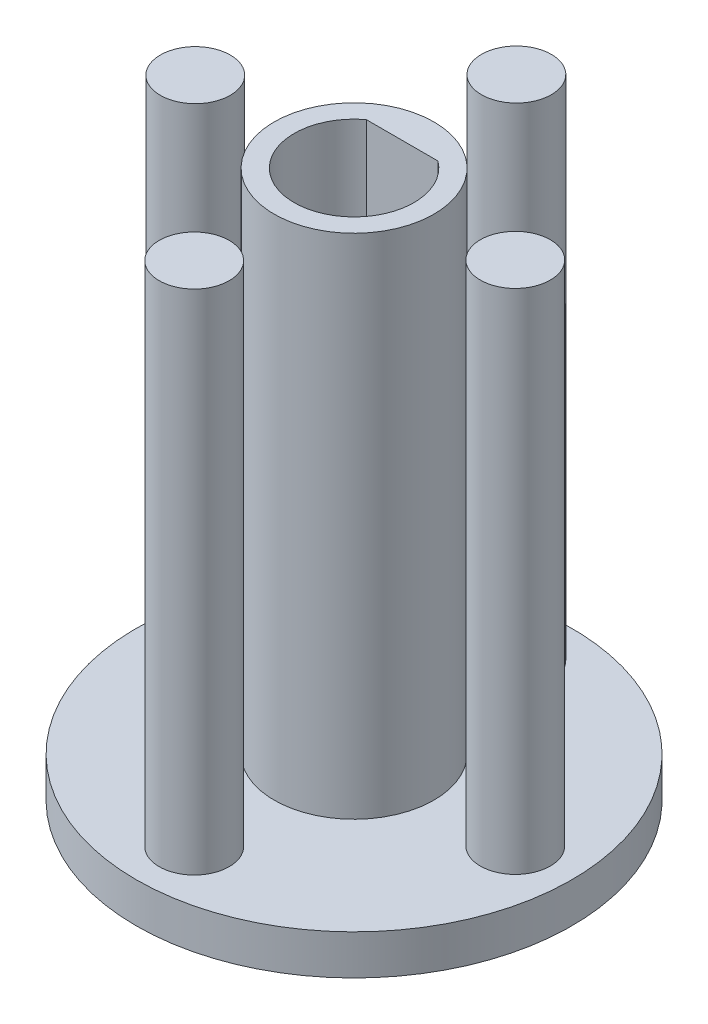
ISO-10303-21;
HEADER;
FILE_DESCRIPTION(('STEP AP214'),'2;1');
FILE_NAME('part.step','',(''),(''),'','','');
FILE_SCHEMA(('AUTOMOTIVE_DESIGN { 1 0 10303 214 1 1 1 1 }'));
ENDSEC;
DATA;
#1=APPLICATION_CONTEXT('core data for automotive mechanical design processes');
#2=APPLICATION_PROTOCOL_DEFINITION('international standard','automotive_design',2000,#1);
#3=PRODUCT_CONTEXT('',#1,'mechanical');
#4=PRODUCT('Part','Part','',(#3));
#5=PRODUCT_RELATED_PRODUCT_CATEGORY('part','',(#4));
#6=PRODUCT_DEFINITION_FORMATION('','',#4);
#7=PRODUCT_DEFINITION_CONTEXT('part definition',#1,'design');
#8=PRODUCT_DEFINITION('design','',#6,#7);
#9=PRODUCT_DEFINITION_SHAPE('','',#8);
#10=(LENGTH_UNIT() NAMED_UNIT(*) SI_UNIT(.MILLI.,.METRE.));
#11=(NAMED_UNIT(*) PLANE_ANGLE_UNIT() SI_UNIT($,.RADIAN.));
#12=(NAMED_UNIT(*) SI_UNIT($,.STERADIAN.) SOLID_ANGLE_UNIT());
#13=UNCERTAINTY_MEASURE_WITH_UNIT(LENGTH_MEASURE(1.E-05),#10,'distance_accuracy_value','');
#14=(GEOMETRIC_REPRESENTATION_CONTEXT(3) GLOBAL_UNCERTAINTY_ASSIGNED_CONTEXT((#13)) GLOBAL_UNIT_ASSIGNED_CONTEXT((#10,
#11,#12)) REPRESENTATION_CONTEXT('',''));
#15=CARTESIAN_POINT('',(0.,0.,0.));
#16=DIRECTION('',(0.,0.,1.));
#17=DIRECTION('',(1.,0.,0.));
#18=AXIS2_PLACEMENT_3D('',#15,#16,#17);
#19=CARTESIAN_POINT('',(0.,2.,0.));
#20=DIRECTION('',(0.,1.,0.));
#21=DIRECTION('',(0.,0.,1.));
#22=AXIS2_PLACEMENT_3D('',#19,#20,#21);
#23=PLANE('',#22);
#24=CARTESIAN_POINT('',(0.,2.,0.));
#25=DIRECTION('',(0.,1.,0.));
#26=DIRECTION('',(0.,0.,1.));
#27=AXIS2_PLACEMENT_3D('',#24,#25,#26);
#28=CIRCLE('',#27,10.9);
#29=CARTESIAN_POINT('',(0.,2.,10.9));
#30=VERTEX_POINT('',#29);
#31=EDGE_CURVE('E110',#30,#30,#28,.T.);
#32=ORIENTED_EDGE('',*,*,#31,.T.);
#33=EDGE_LOOP('',(#32));
#34=FACE_BOUND('',#33,.T.);
#35=CARTESIAN_POINT('',(-7.99946540436632,2.,-0.0531912101153402));
#36=DIRECTION('',(0.,1.,0.));
#37=DIRECTION('',(0.,0.,1.));
#38=AXIS2_PLACEMENT_3D('',#35,#36,#37);
#39=CIRCLE('',#38,1.75);
#40=CARTESIAN_POINT('',(-7.99946540436632,1.99999999999999,-1.80319121011534));
#41=VERTEX_POINT('',#40);
#42=EDGE_CURVE('E46',#41,#41,#39,.T.);
#43=ORIENTED_EDGE('',*,*,#42,.F.);
#44=EDGE_LOOP('',(#43));
#45=FACE_BOUND('',#44,.T.);
#46=CARTESIAN_POINT('',(0.0091799489627781,2.,8.00905715153994));
#47=DIRECTION('',(0.,1.,0.));
#48=DIRECTION('',(0.,0.,1.));
#49=AXIS2_PLACEMENT_3D('',#46,#47,#48);
#50=CIRCLE('',#49,1.75);
#51=CARTESIAN_POINT('',(0.0091799489627781,1.99999999999999,6.25905715153994));
#52=VERTEX_POINT('',#51);
#53=EDGE_CURVE('E106',#52,#52,#50,.F.);
#54=ORIENTED_EDGE('',*,*,#53,.T.);
#55=EDGE_LOOP('',(#54));
#56=FACE_BOUND('',#55,.T.);
#57=CARTESIAN_POINT('',(8.01767982733765,2.,-0.0533357152510716));
#58=DIRECTION('',(0.,1.,0.));
#59=DIRECTION('',(0.,0.,1.));
#60=AXIS2_PLACEMENT_3D('',#57,#58,#59);
#61=CIRCLE('',#60,1.75);
#62=CARTESIAN_POINT('',(8.01767982733765,1.99999999999999,-1.80333571525107));
#63=VERTEX_POINT('',#62);
#64=EDGE_CURVE('E100',#63,#63,#61,.F.);
#65=ORIENTED_EDGE('',*,*,#64,.T.);
#66=EDGE_LOOP('',(#65));
#67=FACE_BOUND('',#66,.T.);
#68=CARTESIAN_POINT('',(0.00903447400855788,2.,-8.11558407690636));
#69=DIRECTION('',(0.,1.,0.));
#70=DIRECTION('',(0.,0.,1.));
#71=AXIS2_PLACEMENT_3D('',#68,#69,#70);
#72=CIRCLE('',#71,1.75000000000001);
#73=CARTESIAN_POINT('',(0.00903447400855788,1.99999999999999,-9.86558407690636));
#74=VERTEX_POINT('',#73);
#75=EDGE_CURVE('E94',#74,#74,#72,.F.);
#76=ORIENTED_EDGE('',*,*,#75,.T.);
#77=EDGE_LOOP('',(#76));
#78=FACE_BOUND('',#77,.T.);
#79=CARTESIAN_POINT('',(0.,2.,0.));
#80=DIRECTION('',(0.,1.,0.));
#81=DIRECTION('',(0.,0.,1.));
#82=AXIS2_PLACEMENT_3D('',#79,#80,#81);
#83=CIRCLE('',#82,4.);
#84=CARTESIAN_POINT('',(0.,1.99999999999999,-4.));
#85=VERTEX_POINT('',#84);
#86=EDGE_CURVE('E88',#85,#85,#83,.F.);
#87=ORIENTED_EDGE('',*,*,#86,.T.);
#88=EDGE_LOOP('',(#87));
#89=FACE_BOUND('',#88,.T.);
#90=ADVANCED_FACE('F42',(#34,#45,#56,#67,#78,#89),#23,.T.);
#91=CARTESIAN_POINT('',(-7.99946540436632,27.4,-0.0531912101153402));
#92=DIRECTION('',(0.,-1.,0.));
#93=DIRECTION('',(0.,0.,-1.));
#94=AXIS2_PLACEMENT_3D('',#91,#92,#93);
#95=CYLINDRICAL_SURFACE('',#94,1.75);
#96=CARTESIAN_POINT('',(-7.99946540436632,27.4,-0.0531912101153402));
#97=DIRECTION('',(0.,1.,0.));
#98=DIRECTION('',(0.,0.,1.));
#99=AXIS2_PLACEMENT_3D('',#96,#97,#98);
#100=CIRCLE('',#99,1.75);
#101=CARTESIAN_POINT('',(-7.99946540436632,27.4,-1.80319121011534));
#102=VERTEX_POINT('',#101);
#103=EDGE_CURVE('E12',#102,#102,#100,.T.);
#104=CARTESIAN_POINT('',(-7.99946540436632,1.99999999999999,-1.80319121011534));
#105=CARTESIAN_POINT('',(-7.99946540436632,2.26458333333333,-1.80319121011534));
#106=CARTESIAN_POINT('',(-7.99946540436632,2.52916666666666,-1.80319121011534));
#107=CARTESIAN_POINT('',(-7.99946540436632,3.05833333333333,-1.80319121011534));
#108=CARTESIAN_POINT('',(-7.99946540436632,3.32291666666666,-1.80319121011534));
#109=CARTESIAN_POINT('',(-7.99946540436632,3.85208333333333,-1.80319121011534));
#110=CARTESIAN_POINT('',(-7.99946540436632,4.11666666666666,-1.80319121011534));
#111=CARTESIAN_POINT('',(-7.99946540436632,4.64583333333333,-1.80319121011534));
#112=CARTESIAN_POINT('',(-7.99946540436632,4.91041666666666,-1.80319121011534));
#113=CARTESIAN_POINT('',(-7.99946540436632,5.43958333333333,-1.80319121011534));
#114=CARTESIAN_POINT('',(-7.99946540436632,5.70416666666666,-1.80319121011534));
#115=CARTESIAN_POINT('',(-7.99946540436632,6.23333333333333,-1.80319121011534));
#116=CARTESIAN_POINT('',(-7.99946540436632,6.49791666666666,-1.80319121011534));
#117=CARTESIAN_POINT('',(-7.99946540436632,7.02708333333333,-1.80319121011534));
#118=CARTESIAN_POINT('',(-7.99946540436632,7.29166666666666,-1.80319121011534));
#119=CARTESIAN_POINT('',(-7.99946540436632,7.82083333333333,-1.80319121011534));
#120=CARTESIAN_POINT('',(-7.99946540436632,8.08541666666666,-1.80319121011534));
#121=CARTESIAN_POINT('',(-7.99946540436632,8.61458333333333,-1.80319121011534));
#122=CARTESIAN_POINT('',(-7.99946540436632,8.87916666666666,-1.80319121011534));
#123=CARTESIAN_POINT('',(-7.99946540436632,9.40833333333333,-1.80319121011534));
#124=CARTESIAN_POINT('',(-7.99946540436632,9.67291666666666,-1.80319121011534));
#125=CARTESIAN_POINT('',(-7.99946540436632,10.2020833333333,-1.80319121011534));
#126=CARTESIAN_POINT('',(-7.99946540436632,10.4666666666667,-1.80319121011534));
#127=CARTESIAN_POINT('',(-7.99946540436632,10.9958333333333,-1.80319121011534));
#128=CARTESIAN_POINT('',(-7.99946540436632,11.2604166666667,-1.80319121011534));
#129=CARTESIAN_POINT('',(-7.99946540436632,11.7895833333333,-1.80319121011534));
#130=CARTESIAN_POINT('',(-7.99946540436632,12.0541666666667,-1.80319121011534));
#131=CARTESIAN_POINT('',(-7.99946540436632,12.5833333333333,-1.80319121011534));
#132=CARTESIAN_POINT('',(-7.99946540436632,12.8479166666667,-1.80319121011534));
#133=CARTESIAN_POINT('',(-7.99946540436632,13.3770833333333,-1.80319121011534));
#134=CARTESIAN_POINT('',(-7.99946540436632,13.6416666666667,-1.80319121011534));
#135=CARTESIAN_POINT('',(-7.99946540436632,14.1708333333333,-1.80319121011534));
#136=CARTESIAN_POINT('',(-7.99946540436632,14.4354166666667,-1.80319121011534));
#137=CARTESIAN_POINT('',(-7.99946540436632,14.9645833333333,-1.80319121011534));
#138=CARTESIAN_POINT('',(-7.99946540436632,15.2291666666667,-1.80319121011534));
#139=CARTESIAN_POINT('',(-7.99946540436632,15.7583333333333,-1.80319121011534));
#140=CARTESIAN_POINT('',(-7.99946540436632,16.0229166666667,-1.80319121011534));
#141=CARTESIAN_POINT('',(-7.99946540436632,16.5520833333333,-1.80319121011534));
#142=CARTESIAN_POINT('',(-7.99946540436632,16.8166666666667,-1.80319121011534));
#143=CARTESIAN_POINT('',(-7.99946540436632,17.3458333333333,-1.80319121011534));
#144=CARTESIAN_POINT('',(-7.99946540436632,17.6104166666667,-1.80319121011534));
#145=CARTESIAN_POINT('',(-7.99946540436632,18.1395833333333,-1.80319121011534));
#146=CARTESIAN_POINT('',(-7.99946540436632,18.4041666666667,-1.80319121011534));
#147=CARTESIAN_POINT('',(-7.99946540436632,18.9333333333333,-1.80319121011534));
#148=CARTESIAN_POINT('',(-7.99946540436632,19.1979166666667,-1.80319121011534));
#149=CARTESIAN_POINT('',(-7.99946540436632,19.7270833333333,-1.80319121011534));
#150=CARTESIAN_POINT('',(-7.99946540436632,19.9916666666667,-1.80319121011534));
#151=CARTESIAN_POINT('',(-7.99946540436632,20.5208333333333,-1.80319121011534));
#152=CARTESIAN_POINT('',(-7.99946540436632,20.7854166666667,-1.80319121011534));
#153=CARTESIAN_POINT('',(-7.99946540436632,21.3145833333333,-1.80319121011534));
#154=CARTESIAN_POINT('',(-7.99946540436632,21.5791666666667,-1.80319121011534));
#155=CARTESIAN_POINT('',(-7.99946540436632,22.1083333333333,-1.80319121011534));
#156=CARTESIAN_POINT('',(-7.99946540436632,22.3729166666667,-1.80319121011534));
#157=CARTESIAN_POINT('',(-7.99946540436632,22.9020833333333,-1.80319121011534));
#158=CARTESIAN_POINT('',(-7.99946540436632,23.1666666666667,-1.80319121011534));
#159=CARTESIAN_POINT('',(-7.99946540436632,23.6958333333333,-1.80319121011534));
#160=CARTESIAN_POINT('',(-7.99946540436632,23.9604166666667,-1.80319121011534));
#161=CARTESIAN_POINT('',(-7.99946540436632,24.4895833333333,-1.80319121011534));
#162=CARTESIAN_POINT('',(-7.99946540436632,24.7541666666667,-1.80319121011534));
#163=CARTESIAN_POINT('',(-7.99946540436632,25.2833333333333,-1.80319121011534));
#164=CARTESIAN_POINT('',(-7.99946540436632,25.5479166666667,-1.80319121011534));
#165=CARTESIAN_POINT('',(-7.99946540436632,26.0770833333333,-1.80319121011534));
#166=CARTESIAN_POINT('',(-7.99946540436632,26.3416666666667,-1.80319121011534));
#167=CARTESIAN_POINT('',(-7.99946540436632,26.8708333333333,-1.80319121011534));
#168=CARTESIAN_POINT('',(-7.99946540436632,27.1354166666667,-1.80319121011534));
#169=CARTESIAN_POINT('',(-7.99946540436632,27.4,-1.80319121011534));
#170=B_SPLINE_CURVE_WITH_KNOTS('',3,(#104,#105,#106,#107,#108,#109,#110,#111,#112,#113,#114,
#115,#116,#117,#118,#119,#120,#121,#122,#123,#124,#125,#126,#127,#128,#129,#130,#131,#132,#133,
#134,#135,#136,#137,#138,#139,#140,#141,#142,#143,#144,#145,#146,#147,#148,#149,#150,#151,#152,
#153,#154,#155,#156,#157,#158,#159,#160,#161,#162,#163,#164,#165,#166,#167,#168,#169),
.UNSPECIFIED.,.F.,.F.,(4,2,2,2,2,2,2,2,2,2,2,2,2,2,2,2,2,2,2,2,2,2,2,2,2,2,2,2,2,2,2,2,4),(0.,
0.793749999999999,1.5875,2.38125,3.175,3.96875,4.7625,5.55625,6.35,7.14375,7.9375,8.73125,9.525,
10.31875,11.1125,11.90625,12.7,13.49375,14.2875,15.08125,15.875,16.66875,17.4625,18.25625,19.05,
19.84375,20.6375,21.43125,22.225,23.01875,23.8125,24.60625,25.4),.UNSPECIFIED.);
#171=EDGE_CURVE('BSEAM44',#41,#102,#170,.T.);
#172=ORIENTED_EDGE('',*,*,#42,.T.);
#173=ORIENTED_EDGE('',*,*,#103,.F.);
#174=ORIENTED_EDGE('',*,*,#171,.T.);
#175=ORIENTED_EDGE('',*,*,#171,.F.);
#176=EDGE_LOOP('',(#172,#174,#173,#175));
#177=FACE_BOUND('',#176,.T.);
#178=ADVANCED_FACE('F44',(#177),#95,.T.);
#179=CARTESIAN_POINT('',(-7.99946540436632,27.4,-0.0531912101153402));
#180=DIRECTION('',(0.,1.,0.));
#181=DIRECTION('',(0.,0.,1.));
#182=AXIS2_PLACEMENT_3D('',#179,#180,#181);
#183=PLANE('',#182);
#184=ORIENTED_EDGE('',*,*,#103,.T.);
#185=EDGE_LOOP('',(#184));
#186=FACE_BOUND('',#185,.T.);
#187=ADVANCED_FACE('F128',(#186),#183,.T.);
#188=CARTESIAN_POINT('',(0.,2.,0.));
#189=DIRECTION('',(0.,-1.,0.));
#190=DIRECTION('',(0.,0.,-1.));
#191=AXIS2_PLACEMENT_3D('',#188,#189,#190);
#192=CYLINDRICAL_SURFACE('',#191,10.9);
#193=ORIENTED_EDGE('',*,*,#31,.F.);
#194=EDGE_LOOP('',(#193));
#195=FACE_BOUND('',#194,.T.);
#196=CARTESIAN_POINT('',(0.,0.,0.));
#197=DIRECTION('',(0.,1.,0.));
#198=DIRECTION('',(0.,0.,1.));
#199=AXIS2_PLACEMENT_3D('',#196,#197,#198);
#200=CIRCLE('',#199,10.9);
#201=CARTESIAN_POINT('',(0.,0.,10.9));
#202=VERTEX_POINT('',#201);
#203=EDGE_CURVE('E109',#202,#202,#200,.T.);
#204=ORIENTED_EDGE('',*,*,#203,.T.);
#205=EDGE_LOOP('',(#204));
#206=FACE_BOUND('',#205,.T.);
#207=ADVANCED_FACE('F116',(#195,#206),#192,.T.);
#208=CARTESIAN_POINT('',(-7.99946540436632,0.,-0.0531912101153402));
#209=DIRECTION('',(0.,1.,0.));
#210=DIRECTION('',(0.,0.,1.));
#211=AXIS2_PLACEMENT_3D('',#208,#209,#210);
#212=PLANE('',#211);
#213=ORIENTED_EDGE('',*,*,#203,.F.);
#214=EDGE_LOOP('',(#213));
#215=FACE_BOUND('',#214,.T.);
#216=ADVANCED_FACE('F118',(#215),#212,.F.);
#217=CARTESIAN_POINT('',(0.0091799489627781,27.4,8.00905715153994));
#218=DIRECTION('',(0.,-1.,0.));
#219=DIRECTION('',(0.,0.,-1.));
#220=AXIS2_PLACEMENT_3D('',#217,#218,#219);
#221=CYLINDRICAL_SURFACE('',#220,1.75);
#222=CARTESIAN_POINT('',(0.0091799489627781,27.4,8.00905715153994));
#223=DIRECTION('',(0.,1.,0.));
#224=DIRECTION('',(0.,0.,1.));
#225=AXIS2_PLACEMENT_3D('',#222,#223,#224);
#226=CIRCLE('',#225,1.75);
#227=CARTESIAN_POINT('',(0.0091799489627781,27.4,6.25905715153994));
#228=VERTEX_POINT('',#227);
#229=EDGE_CURVE('E103',#228,#228,#226,.T.);
#230=CARTESIAN_POINT('',(0.0091799489627781,1.99999999999999,6.25905715153994));
#231=CARTESIAN_POINT('',(0.0091799489627781,2.26458333333333,6.25905715153994));
#232=CARTESIAN_POINT('',(0.0091799489627781,2.52916666666666,6.25905715153994));
#233=CARTESIAN_POINT('',(0.0091799489627781,3.05833333333333,6.25905715153994));
#234=CARTESIAN_POINT('',(0.0091799489627781,3.32291666666666,6.25905715153994));
#235=CARTESIAN_POINT('',(0.0091799489627781,3.85208333333333,6.25905715153994));
#236=CARTESIAN_POINT('',(0.0091799489627781,4.11666666666666,6.25905715153994));
#237=CARTESIAN_POINT('',(0.0091799489627781,4.64583333333333,6.25905715153994));
#238=CARTESIAN_POINT('',(0.0091799489627781,4.91041666666666,6.25905715153994));
#239=CARTESIAN_POINT('',(0.0091799489627781,5.43958333333333,6.25905715153994));
#240=CARTESIAN_POINT('',(0.0091799489627781,5.70416666666666,6.25905715153994));
#241=CARTESIAN_POINT('',(0.0091799489627781,6.23333333333333,6.25905715153994));
#242=CARTESIAN_POINT('',(0.0091799489627781,6.49791666666666,6.25905715153994));
#243=CARTESIAN_POINT('',(0.0091799489627781,7.02708333333333,6.25905715153994));
#244=CARTESIAN_POINT('',(0.0091799489627781,7.29166666666666,6.25905715153994));
#245=CARTESIAN_POINT('',(0.0091799489627781,7.82083333333333,6.25905715153994));
#246=CARTESIAN_POINT('',(0.0091799489627781,8.08541666666666,6.25905715153994));
#247=CARTESIAN_POINT('',(0.0091799489627781,8.61458333333333,6.25905715153994));
#248=CARTESIAN_POINT('',(0.0091799489627781,8.87916666666666,6.25905715153994));
#249=CARTESIAN_POINT('',(0.0091799489627781,9.40833333333333,6.25905715153994));
#250=CARTESIAN_POINT('',(0.0091799489627781,9.67291666666666,6.25905715153994));
#251=CARTESIAN_POINT('',(0.0091799489627781,10.2020833333333,6.25905715153994));
#252=CARTESIAN_POINT('',(0.0091799489627781,10.4666666666667,6.25905715153994));
#253=CARTESIAN_POINT('',(0.0091799489627781,10.9958333333333,6.25905715153994));
#254=CARTESIAN_POINT('',(0.0091799489627781,11.2604166666667,6.25905715153994));
#255=CARTESIAN_POINT('',(0.0091799489627781,11.7895833333333,6.25905715153994));
#256=CARTESIAN_POINT('',(0.0091799489627781,12.0541666666667,6.25905715153994));
#257=CARTESIAN_POINT('',(0.0091799489627781,12.5833333333333,6.25905715153994));
#258=CARTESIAN_POINT('',(0.0091799489627781,12.8479166666667,6.25905715153994));
#259=CARTESIAN_POINT('',(0.0091799489627781,13.3770833333333,6.25905715153994));
#260=CARTESIAN_POINT('',(0.0091799489627781,13.6416666666667,6.25905715153994));
#261=CARTESIAN_POINT('',(0.0091799489627781,14.1708333333333,6.25905715153994));
#262=CARTESIAN_POINT('',(0.0091799489627781,14.4354166666667,6.25905715153994));
#263=CARTESIAN_POINT('',(0.0091799489627781,14.9645833333333,6.25905715153994));
#264=CARTESIAN_POINT('',(0.0091799489627781,15.2291666666667,6.25905715153994));
#265=CARTESIAN_POINT('',(0.0091799489627781,15.7583333333333,6.25905715153994));
#266=CARTESIAN_POINT('',(0.0091799489627781,16.0229166666667,6.25905715153994));
#267=CARTESIAN_POINT('',(0.0091799489627781,16.5520833333333,6.25905715153994));
#268=CARTESIAN_POINT('',(0.0091799489627781,16.8166666666667,6.25905715153994));
#269=CARTESIAN_POINT('',(0.0091799489627781,17.3458333333333,6.25905715153994));
#270=CARTESIAN_POINT('',(0.0091799489627781,17.6104166666667,6.25905715153994));
#271=CARTESIAN_POINT('',(0.0091799489627781,18.1395833333333,6.25905715153994));
#272=CARTESIAN_POINT('',(0.0091799489627781,18.4041666666667,6.25905715153994));
#273=CARTESIAN_POINT('',(0.0091799489627781,18.9333333333333,6.25905715153994));
#274=CARTESIAN_POINT('',(0.0091799489627781,19.1979166666667,6.25905715153994));
#275=CARTESIAN_POINT('',(0.0091799489627781,19.7270833333333,6.25905715153994));
#276=CARTESIAN_POINT('',(0.0091799489627781,19.9916666666667,6.25905715153994));
#277=CARTESIAN_POINT('',(0.0091799489627781,20.5208333333333,6.25905715153994));
#278=CARTESIAN_POINT('',(0.0091799489627781,20.7854166666667,6.25905715153994));
#279=CARTESIAN_POINT('',(0.0091799489627781,21.3145833333333,6.25905715153994));
#280=CARTESIAN_POINT('',(0.0091799489627781,21.5791666666667,6.25905715153994));
#281=CARTESIAN_POINT('',(0.0091799489627781,22.1083333333333,6.25905715153994));
#282=CARTESIAN_POINT('',(0.0091799489627781,22.3729166666667,6.25905715153994));
#283=CARTESIAN_POINT('',(0.0091799489627781,22.9020833333333,6.25905715153994));
#284=CARTESIAN_POINT('',(0.0091799489627781,23.1666666666667,6.25905715153994));
#285=CARTESIAN_POINT('',(0.0091799489627781,23.6958333333333,6.25905715153994));
#286=CARTESIAN_POINT('',(0.0091799489627781,23.9604166666667,6.25905715153994));
#287=CARTESIAN_POINT('',(0.0091799489627781,24.4895833333333,6.25905715153994));
#288=CARTESIAN_POINT('',(0.0091799489627781,24.7541666666667,6.25905715153994));
#289=CARTESIAN_POINT('',(0.0091799489627781,25.2833333333333,6.25905715153994));
#290=CARTESIAN_POINT('',(0.0091799489627781,25.5479166666667,6.25905715153994));
#291=CARTESIAN_POINT('',(0.0091799489627781,26.0770833333333,6.25905715153994));
#292=CARTESIAN_POINT('',(0.0091799489627781,26.3416666666667,6.25905715153994));
#293=CARTESIAN_POINT('',(0.0091799489627781,26.8708333333333,6.25905715153994));
#294=CARTESIAN_POINT('',(0.0091799489627781,27.1354166666667,6.25905715153994));
#295=CARTESIAN_POINT('',(0.0091799489627781,27.4,6.25905715153994));
#296=B_SPLINE_CURVE_WITH_KNOTS('',3,(#230,#231,#232,#233,#234,#235,#236,#237,#238,#239,#240,
#241,#242,#243,#244,#245,#246,#247,#248,#249,#250,#251,#252,#253,#254,#255,#256,#257,#258,#259,
#260,#261,#262,#263,#264,#265,#266,#267,#268,#269,#270,#271,#272,#273,#274,#275,#276,#277,#278,
#279,#280,#281,#282,#283,#284,#285,#286,#287,#288,#289,#290,#291,#292,#293,#294,#295),
.UNSPECIFIED.,.F.,.F.,(4,2,2,2,2,2,2,2,2,2,2,2,2,2,2,2,2,2,2,2,2,2,2,2,2,2,2,2,2,2,2,2,4),(0.,
0.793749999999999,1.5875,2.38125,3.175,3.96875,4.7625,5.55625,6.35,7.14375,7.9375,8.73125,9.525,
10.31875,11.1125,11.90625,12.7,13.49375,14.2875,15.08125,15.875,16.66875,17.4625,18.25625,19.05,
19.84375,20.6375,21.43125,22.225,23.01875,23.8125,24.60625,25.4),.UNSPECIFIED.);
#297=EDGE_CURVE('BSEAM120',#52,#228,#296,.T.);
#298=ORIENTED_EDGE('',*,*,#53,.F.);
#299=ORIENTED_EDGE('',*,*,#229,.F.);
#300=ORIENTED_EDGE('',*,*,#297,.T.);
#301=ORIENTED_EDGE('',*,*,#297,.F.);
#302=EDGE_LOOP('',(#298,#300,#299,#301));
#303=FACE_BOUND('',#302,.T.);
#304=ADVANCED_FACE('F120',(#303),#221,.T.);
#305=CARTESIAN_POINT('',(0.0091799489627781,27.4,8.00905715153994));
#306=DIRECTION('',(0.,1.,0.));
#307=DIRECTION('',(0.,0.,1.));
#308=AXIS2_PLACEMENT_3D('',#305,#306,#307);
#309=PLANE('',#308);
#310=ORIENTED_EDGE('',*,*,#229,.T.);
#311=EDGE_LOOP('',(#310));
#312=FACE_BOUND('',#311,.T.);
#313=ADVANCED_FACE('F125',(#312),#309,.T.);
#314=CARTESIAN_POINT('',(8.01767982733765,27.4,-0.0533357152510716));
#315=DIRECTION('',(0.,-1.,0.));
#316=DIRECTION('',(0.,0.,-1.));
#317=AXIS2_PLACEMENT_3D('',#314,#315,#316);
#318=CYLINDRICAL_SURFACE('',#317,1.75);
#319=CARTESIAN_POINT('',(8.01767982733765,27.4,-0.0533357152510716));
#320=DIRECTION('',(0.,1.,0.));
#321=DIRECTION('',(0.,0.,1.));
#322=AXIS2_PLACEMENT_3D('',#319,#320,#321);
#323=CIRCLE('',#322,1.75);
#324=CARTESIAN_POINT('',(8.01767982733765,27.4,-1.80333571525107));
#325=VERTEX_POINT('',#324);
#326=EDGE_CURVE('E97',#325,#325,#323,.T.);
#327=CARTESIAN_POINT('',(8.01767982733765,1.99999999999999,-1.80333571525107));
#328=CARTESIAN_POINT('',(8.01767982733765,2.26458333333333,-1.80333571525107));
#329=CARTESIAN_POINT('',(8.01767982733765,2.52916666666666,-1.80333571525107));
#330=CARTESIAN_POINT('',(8.01767982733765,3.05833333333333,-1.80333571525107));
#331=CARTESIAN_POINT('',(8.01767982733765,3.32291666666666,-1.80333571525107));
#332=CARTESIAN_POINT('',(8.01767982733765,3.85208333333333,-1.80333571525107));
#333=CARTESIAN_POINT('',(8.01767982733765,4.11666666666666,-1.80333571525107));
#334=CARTESIAN_POINT('',(8.01767982733765,4.64583333333333,-1.80333571525107));
#335=CARTESIAN_POINT('',(8.01767982733765,4.91041666666666,-1.80333571525107));
#336=CARTESIAN_POINT('',(8.01767982733765,5.43958333333333,-1.80333571525107));
#337=CARTESIAN_POINT('',(8.01767982733765,5.70416666666666,-1.80333571525107));
#338=CARTESIAN_POINT('',(8.01767982733765,6.23333333333333,-1.80333571525107));
#339=CARTESIAN_POINT('',(8.01767982733765,6.49791666666666,-1.80333571525107));
#340=CARTESIAN_POINT('',(8.01767982733765,7.02708333333333,-1.80333571525107));
#341=CARTESIAN_POINT('',(8.01767982733765,7.29166666666666,-1.80333571525107));
#342=CARTESIAN_POINT('',(8.01767982733765,7.82083333333333,-1.80333571525107));
#343=CARTESIAN_POINT('',(8.01767982733765,8.08541666666666,-1.80333571525107));
#344=CARTESIAN_POINT('',(8.01767982733765,8.61458333333333,-1.80333571525107));
#345=CARTESIAN_POINT('',(8.01767982733765,8.87916666666666,-1.80333571525107));
#346=CARTESIAN_POINT('',(8.01767982733765,9.40833333333333,-1.80333571525107));
#347=CARTESIAN_POINT('',(8.01767982733765,9.67291666666666,-1.80333571525107));
#348=CARTESIAN_POINT('',(8.01767982733765,10.2020833333333,-1.80333571525107));
#349=CARTESIAN_POINT('',(8.01767982733765,10.4666666666667,-1.80333571525107));
#350=CARTESIAN_POINT('',(8.01767982733765,10.9958333333333,-1.80333571525107));
#351=CARTESIAN_POINT('',(8.01767982733765,11.2604166666667,-1.80333571525107));
#352=CARTESIAN_POINT('',(8.01767982733765,11.7895833333333,-1.80333571525107));
#353=CARTESIAN_POINT('',(8.01767982733765,12.0541666666667,-1.80333571525107));
#354=CARTESIAN_POINT('',(8.01767982733765,12.5833333333333,-1.80333571525107));
#355=CARTESIAN_POINT('',(8.01767982733765,12.8479166666667,-1.80333571525107));
#356=CARTESIAN_POINT('',(8.01767982733765,13.3770833333333,-1.80333571525107));
#357=CARTESIAN_POINT('',(8.01767982733765,13.6416666666667,-1.80333571525107));
#358=CARTESIAN_POINT('',(8.01767982733765,14.1708333333333,-1.80333571525107));
#359=CARTESIAN_POINT('',(8.01767982733765,14.4354166666667,-1.80333571525107));
#360=CARTESIAN_POINT('',(8.01767982733765,14.9645833333333,-1.80333571525107));
#361=CARTESIAN_POINT('',(8.01767982733765,15.2291666666667,-1.80333571525107));
#362=CARTESIAN_POINT('',(8.01767982733765,15.7583333333333,-1.80333571525107));
#363=CARTESIAN_POINT('',(8.01767982733765,16.0229166666667,-1.80333571525107));
#364=CARTESIAN_POINT('',(8.01767982733765,16.5520833333333,-1.80333571525107));
#365=CARTESIAN_POINT('',(8.01767982733765,16.8166666666667,-1.80333571525107));
#366=CARTESIAN_POINT('',(8.01767982733765,17.3458333333333,-1.80333571525107));
#367=CARTESIAN_POINT('',(8.01767982733765,17.6104166666667,-1.80333571525107));
#368=CARTESIAN_POINT('',(8.01767982733765,18.1395833333333,-1.80333571525107));
#369=CARTESIAN_POINT('',(8.01767982733765,18.4041666666667,-1.80333571525107));
#370=CARTESIAN_POINT('',(8.01767982733765,18.9333333333333,-1.80333571525107));
#371=CARTESIAN_POINT('',(8.01767982733765,19.1979166666667,-1.80333571525107));
#372=CARTESIAN_POINT('',(8.01767982733765,19.7270833333333,-1.80333571525107));
#373=CARTESIAN_POINT('',(8.01767982733765,19.9916666666667,-1.80333571525107));
#374=CARTESIAN_POINT('',(8.01767982733765,20.5208333333333,-1.80333571525107));
#375=CARTESIAN_POINT('',(8.01767982733765,20.7854166666667,-1.80333571525107));
#376=CARTESIAN_POINT('',(8.01767982733765,21.3145833333333,-1.80333571525107));
#377=CARTESIAN_POINT('',(8.01767982733765,21.5791666666667,-1.80333571525107));
#378=CARTESIAN_POINT('',(8.01767982733765,22.1083333333333,-1.80333571525107));
#379=CARTESIAN_POINT('',(8.01767982733765,22.3729166666667,-1.80333571525107));
#380=CARTESIAN_POINT('',(8.01767982733765,22.9020833333333,-1.80333571525107));
#381=CARTESIAN_POINT('',(8.01767982733765,23.1666666666667,-1.80333571525107));
#382=CARTESIAN_POINT('',(8.01767982733765,23.6958333333333,-1.80333571525107));
#383=CARTESIAN_POINT('',(8.01767982733765,23.9604166666667,-1.80333571525107));
#384=CARTESIAN_POINT('',(8.01767982733765,24.4895833333333,-1.80333571525107));
#385=CARTESIAN_POINT('',(8.01767982733765,24.7541666666667,-1.80333571525107));
#386=CARTESIAN_POINT('',(8.01767982733765,25.2833333333333,-1.80333571525107));
#387=CARTESIAN_POINT('',(8.01767982733765,25.5479166666667,-1.80333571525107));
#388=CARTESIAN_POINT('',(8.01767982733765,26.0770833333333,-1.80333571525107));
#389=CARTESIAN_POINT('',(8.01767982733765,26.3416666666667,-1.80333571525107));
#390=CARTESIAN_POINT('',(8.01767982733765,26.8708333333333,-1.80333571525107));
#391=CARTESIAN_POINT('',(8.01767982733765,27.1354166666667,-1.80333571525107));
#392=CARTESIAN_POINT('',(8.01767982733765,27.4,-1.80333571525107));
#393=B_SPLINE_CURVE_WITH_KNOTS('',3,(#327,#328,#329,#330,#331,#332,#333,#334,#335,#336,#337,
#338,#339,#340,#341,#342,#343,#344,#345,#346,#347,#348,#349,#350,#351,#352,#353,#354,#355,#356,
#357,#358,#359,#360,#361,#362,#363,#364,#365,#366,#367,#368,#369,#370,#371,#372,#373,#374,#375,
#376,#377,#378,#379,#380,#381,#382,#383,#384,#385,#386,#387,#388,#389,#390,#391,#392),
.UNSPECIFIED.,.F.,.F.,(4,2,2,2,2,2,2,2,2,2,2,2,2,2,2,2,2,2,2,2,2,2,2,2,2,2,2,2,2,2,2,2,4),(0.,
0.793749999999999,1.5875,2.38125,3.175,3.96875,4.7625,5.55625,6.35,7.14375,7.9375,8.73125,9.525,
10.31875,11.1125,11.90625,12.7,13.49375,14.2875,15.08125,15.875,16.66875,17.4625,18.25625,19.05,
19.84375,20.6375,21.43125,22.225,23.01875,23.8125,24.60625,25.4),.UNSPECIFIED.);
#394=EDGE_CURVE('BSEAM164',#63,#325,#393,.T.);
#395=ORIENTED_EDGE('',*,*,#64,.F.);
#396=ORIENTED_EDGE('',*,*,#326,.F.);
#397=ORIENTED_EDGE('',*,*,#394,.T.);
#398=ORIENTED_EDGE('',*,*,#394,.F.);
#399=EDGE_LOOP('',(#395,#397,#396,#398));
#400=FACE_BOUND('',#399,.T.);
#401=ADVANCED_FACE('F164',(#400),#318,.T.);
#402=CARTESIAN_POINT('',(8.01767982733765,27.4,-0.0533357152510716));
#403=DIRECTION('',(0.,1.,0.));
#404=DIRECTION('',(0.,0.,1.));
#405=AXIS2_PLACEMENT_3D('',#402,#403,#404);
#406=PLANE('',#405);
#407=ORIENTED_EDGE('',*,*,#326,.T.);
#408=EDGE_LOOP('',(#407));
#409=FACE_BOUND('',#408,.T.);
#410=ADVANCED_FACE('F159',(#409),#406,.T.);
#411=CARTESIAN_POINT('',(0.00903447400855788,27.4,-8.11558407690636));
#412=DIRECTION('',(0.,-1.,0.));
#413=DIRECTION('',(0.,0.,-1.));
#414=AXIS2_PLACEMENT_3D('',#411,#412,#413);
#415=CYLINDRICAL_SURFACE('',#414,1.75000000000001);
#416=CARTESIAN_POINT('',(0.00903447400855788,27.4,-8.11558407690636));
#417=DIRECTION('',(0.,1.,0.));
#418=DIRECTION('',(0.,0.,1.));
#419=AXIS2_PLACEMENT_3D('',#416,#417,#418);
#420=CIRCLE('',#419,1.75000000000001);
#421=CARTESIAN_POINT('',(0.00903447400855788,27.4,-9.86558407690636));
#422=VERTEX_POINT('',#421);
#423=EDGE_CURVE('E91',#422,#422,#420,.T.);
#424=CARTESIAN_POINT('',(0.00903447400855788,1.99999999999999,-9.86558407690636));
#425=CARTESIAN_POINT('',(0.00903447400855788,2.26458333333333,-9.86558407690636));
#426=CARTESIAN_POINT('',(0.00903447400855788,2.52916666666666,-9.86558407690636));
#427=CARTESIAN_POINT('',(0.00903447400855788,3.05833333333333,-9.86558407690636));
#428=CARTESIAN_POINT('',(0.00903447400855788,3.32291666666666,-9.86558407690636));
#429=CARTESIAN_POINT('',(0.00903447400855788,3.85208333333333,-9.86558407690636));
#430=CARTESIAN_POINT('',(0.00903447400855788,4.11666666666666,-9.86558407690636));
#431=CARTESIAN_POINT('',(0.00903447400855788,4.64583333333333,-9.86558407690636));
#432=CARTESIAN_POINT('',(0.00903447400855788,4.91041666666666,-9.86558407690636));
#433=CARTESIAN_POINT('',(0.00903447400855788,5.43958333333333,-9.86558407690636));
#434=CARTESIAN_POINT('',(0.00903447400855788,5.70416666666666,-9.86558407690636));
#435=CARTESIAN_POINT('',(0.00903447400855788,6.23333333333333,-9.86558407690636));
#436=CARTESIAN_POINT('',(0.00903447400855788,6.49791666666666,-9.86558407690636));
#437=CARTESIAN_POINT('',(0.00903447400855788,7.02708333333333,-9.86558407690636));
#438=CARTESIAN_POINT('',(0.00903447400855788,7.29166666666666,-9.86558407690636));
#439=CARTESIAN_POINT('',(0.00903447400855788,7.82083333333333,-9.86558407690636));
#440=CARTESIAN_POINT('',(0.00903447400855788,8.08541666666666,-9.86558407690636));
#441=CARTESIAN_POINT('',(0.00903447400855788,8.61458333333333,-9.86558407690636));
#442=CARTESIAN_POINT('',(0.00903447400855788,8.87916666666666,-9.86558407690636));
#443=CARTESIAN_POINT('',(0.00903447400855788,9.40833333333333,-9.86558407690636));
#444=CARTESIAN_POINT('',(0.00903447400855788,9.67291666666666,-9.86558407690636));
#445=CARTESIAN_POINT('',(0.00903447400855788,10.2020833333333,-9.86558407690636));
#446=CARTESIAN_POINT('',(0.00903447400855788,10.4666666666667,-9.86558407690636));
#447=CARTESIAN_POINT('',(0.00903447400855788,10.9958333333333,-9.86558407690636));
#448=CARTESIAN_POINT('',(0.00903447400855788,11.2604166666667,-9.86558407690636));
#449=CARTESIAN_POINT('',(0.00903447400855788,11.7895833333333,-9.86558407690636));
#450=CARTESIAN_POINT('',(0.00903447400855788,12.0541666666667,-9.86558407690636));
#451=CARTESIAN_POINT('',(0.00903447400855788,12.5833333333333,-9.86558407690636));
#452=CARTESIAN_POINT('',(0.00903447400855788,12.8479166666667,-9.86558407690636));
#453=CARTESIAN_POINT('',(0.00903447400855788,13.3770833333333,-9.86558407690636));
#454=CARTESIAN_POINT('',(0.00903447400855788,13.6416666666667,-9.86558407690636));
#455=CARTESIAN_POINT('',(0.00903447400855788,14.1708333333333,-9.86558407690636));
#456=CARTESIAN_POINT('',(0.00903447400855788,14.4354166666667,-9.86558407690636));
#457=CARTESIAN_POINT('',(0.00903447400855788,14.9645833333333,-9.86558407690636));
#458=CARTESIAN_POINT('',(0.00903447400855788,15.2291666666667,-9.86558407690636));
#459=CARTESIAN_POINT('',(0.00903447400855788,15.7583333333333,-9.86558407690636));
#460=CARTESIAN_POINT('',(0.00903447400855788,16.0229166666667,-9.86558407690636));
#461=CARTESIAN_POINT('',(0.00903447400855788,16.5520833333333,-9.86558407690636));
#462=CARTESIAN_POINT('',(0.00903447400855788,16.8166666666667,-9.86558407690636));
#463=CARTESIAN_POINT('',(0.00903447400855788,17.3458333333333,-9.86558407690636));
#464=CARTESIAN_POINT('',(0.00903447400855788,17.6104166666667,-9.86558407690636));
#465=CARTESIAN_POINT('',(0.00903447400855788,18.1395833333333,-9.86558407690636));
#466=CARTESIAN_POINT('',(0.00903447400855788,18.4041666666667,-9.86558407690636));
#467=CARTESIAN_POINT('',(0.00903447400855788,18.9333333333333,-9.86558407690636));
#468=CARTESIAN_POINT('',(0.00903447400855788,19.1979166666667,-9.86558407690636));
#469=CARTESIAN_POINT('',(0.00903447400855788,19.7270833333333,-9.86558407690636));
#470=CARTESIAN_POINT('',(0.00903447400855788,19.9916666666667,-9.86558407690636));
#471=CARTESIAN_POINT('',(0.00903447400855788,20.5208333333333,-9.86558407690636));
#472=CARTESIAN_POINT('',(0.00903447400855788,20.7854166666667,-9.86558407690636));
#473=CARTESIAN_POINT('',(0.00903447400855788,21.3145833333333,-9.86558407690636));
#474=CARTESIAN_POINT('',(0.00903447400855788,21.5791666666667,-9.86558407690636));
#475=CARTESIAN_POINT('',(0.00903447400855788,22.1083333333333,-9.86558407690636));
#476=CARTESIAN_POINT('',(0.00903447400855788,22.3729166666667,-9.86558407690636));
#477=CARTESIAN_POINT('',(0.00903447400855788,22.9020833333333,-9.86558407690636));
#478=CARTESIAN_POINT('',(0.00903447400855788,23.1666666666667,-9.86558407690636));
#479=CARTESIAN_POINT('',(0.00903447400855788,23.6958333333333,-9.86558407690636));
#480=CARTESIAN_POINT('',(0.00903447400855788,23.9604166666667,-9.86558407690636));
#481=CARTESIAN_POINT('',(0.00903447400855788,24.4895833333333,-9.86558407690636));
#482=CARTESIAN_POINT('',(0.00903447400855788,24.7541666666667,-9.86558407690636));
#483=CARTESIAN_POINT('',(0.00903447400855788,25.2833333333333,-9.86558407690636));
#484=CARTESIAN_POINT('',(0.00903447400855788,25.5479166666667,-9.86558407690636));
#485=CARTESIAN_POINT('',(0.00903447400855788,26.0770833333333,-9.86558407690636));
#486=CARTESIAN_POINT('',(0.00903447400855788,26.3416666666667,-9.86558407690636));
#487=CARTESIAN_POINT('',(0.00903447400855788,26.8708333333333,-9.86558407690636));
#488=CARTESIAN_POINT('',(0.00903447400855788,27.1354166666667,-9.86558407690636));
#489=CARTESIAN_POINT('',(0.00903447400855788,27.4,-9.86558407690636));
#490=B_SPLINE_CURVE_WITH_KNOTS('',3,(#424,#425,#426,#427,#428,#429,#430,#431,#432,#433,#434,
#435,#436,#437,#438,#439,#440,#441,#442,#443,#444,#445,#446,#447,#448,#449,#450,#451,#452,#453,
#454,#455,#456,#457,#458,#459,#460,#461,#462,#463,#464,#465,#466,#467,#468,#469,#470,#471,#472,
#473,#474,#475,#476,#477,#478,#479,#480,#481,#482,#483,#484,#485,#486,#487,#488,#489),
.UNSPECIFIED.,.F.,.F.,(4,2,2,2,2,2,2,2,2,2,2,2,2,2,2,2,2,2,2,2,2,2,2,2,2,2,2,2,2,2,2,2,4),(0.,
0.793749999999999,1.5875,2.38125,3.175,3.96875,4.7625,5.55625,6.35,7.14375,7.9375,8.73125,9.525,
10.31875,11.1125,11.90625,12.7,13.49375,14.2875,15.08125,15.875,16.66875,17.4625,18.25625,19.05,
19.84375,20.6375,21.43125,22.225,23.01875,23.8125,24.60625,25.4),.UNSPECIFIED.);
#491=EDGE_CURVE('BSEAM155',#74,#422,#490,.T.);
#492=ORIENTED_EDGE('',*,*,#75,.F.);
#493=ORIENTED_EDGE('',*,*,#423,.F.);
#494=ORIENTED_EDGE('',*,*,#491,.T.);
#495=ORIENTED_EDGE('',*,*,#491,.F.);
#496=EDGE_LOOP('',(#492,#494,#493,#495));
#497=FACE_BOUND('',#496,.T.);
#498=ADVANCED_FACE('F155',(#497),#415,.T.);
#499=CARTESIAN_POINT('',(0.00903447400855788,27.4,-8.11558407690636));
#500=DIRECTION('',(0.,1.,0.));
#501=DIRECTION('',(0.,0.,1.));
#502=AXIS2_PLACEMENT_3D('',#499,#500,#501);
#503=PLANE('',#502);
#504=ORIENTED_EDGE('',*,*,#423,.T.);
#505=EDGE_LOOP('',(#504));
#506=FACE_BOUND('',#505,.T.);
#507=ADVANCED_FACE('F158',(#506),#503,.T.);
#508=CARTESIAN_POINT('',(0.,27.4,0.));
#509=DIRECTION('',(0.,1.,0.));
#510=DIRECTION('',(0.,0.,1.));
#511=AXIS2_PLACEMENT_3D('',#508,#509,#510);
#512=PLANE('',#511);
#513=CARTESIAN_POINT('',(0.,27.4,0.));
#514=DIRECTION('',(0.,1.,0.));
#515=DIRECTION('',(0.,0.,1.));
#516=AXIS2_PLACEMENT_3D('',#513,#514,#515);
#517=CIRCLE('',#516,4.);
#518=CARTESIAN_POINT('',(0.,27.4,-4.));
#519=VERTEX_POINT('',#518);
#520=EDGE_CURVE('E75',#519,#519,#517,.T.);
#521=ORIENTED_EDGE('',*,*,#520,.T.);
#522=EDGE_LOOP('',(#521));
#523=FACE_BOUND('',#522,.T.);
#524=DIRECTION('',(1.,0.,0.));
#525=VECTOR('',#524,1.);
#526=CARTESIAN_POINT('',(-1.79321148520059,27.4,-2.40507641652915));
#527=LINE('',#526,#525);
#528=CARTESIAN_POINT('',(-1.79321148520059,27.4,-2.40507641652915));
#529=VERTEX_POINT('',#528);
#530=CARTESIAN_POINT('',(1.79321148520059,27.4,-2.40507641652915));
#531=VERTEX_POINT('',#530);
#532=EDGE_CURVE('E71',#529,#531,#527,.T.);
#533=ORIENTED_EDGE('',*,*,#532,.T.);
#534=CARTESIAN_POINT('',(0.,27.4,0.));
#535=DIRECTION('',(0.,1.,0.));
#536=DIRECTION('',(0.,0.,1.));
#537=AXIS2_PLACEMENT_3D('',#534,#535,#536);
#538=CIRCLE('',#537,3.);
#539=EDGE_CURVE('E77',#529,#531,#538,.T.);
#540=ORIENTED_EDGE('',*,*,#539,.F.);
#541=EDGE_LOOP('',(#533,#540));
#542=FACE_BOUND('',#541,.T.);
#543=ADVANCED_FACE('F81',(#523,#542),#512,.T.);
#544=CARTESIAN_POINT('',(0.,27.4,0.));
#545=DIRECTION('',(0.,-1.,0.));
#546=DIRECTION('',(0.,0.,-1.));
#547=AXIS2_PLACEMENT_3D('',#544,#545,#546);
#548=CYLINDRICAL_SURFACE('',#547,4.);
#549=CARTESIAN_POINT('',(0.,1.99999999999999,-4.));
#550=CARTESIAN_POINT('',(0.,2.26458333333333,-4.));
#551=CARTESIAN_POINT('',(0.,2.52916666666666,-4.));
#552=CARTESIAN_POINT('',(0.,3.05833333333333,-4.));
#553=CARTESIAN_POINT('',(0.,3.32291666666666,-4.));
#554=CARTESIAN_POINT('',(0.,3.85208333333333,-4.));
#555=CARTESIAN_POINT('',(0.,4.11666666666666,-4.));
#556=CARTESIAN_POINT('',(0.,4.64583333333333,-4.));
#557=CARTESIAN_POINT('',(0.,4.91041666666666,-4.));
#558=CARTESIAN_POINT('',(0.,5.43958333333333,-4.));
#559=CARTESIAN_POINT('',(0.,5.70416666666666,-4.));
#560=CARTESIAN_POINT('',(0.,6.23333333333333,-4.));
#561=CARTESIAN_POINT('',(0.,6.49791666666666,-4.));
#562=CARTESIAN_POINT('',(0.,7.02708333333333,-4.));
#563=CARTESIAN_POINT('',(0.,7.29166666666666,-4.));
#564=CARTESIAN_POINT('',(0.,7.82083333333333,-4.));
#565=CARTESIAN_POINT('',(0.,8.08541666666666,-4.));
#566=CARTESIAN_POINT('',(0.,8.61458333333333,-4.));
#567=CARTESIAN_POINT('',(0.,8.87916666666666,-4.));
#568=CARTESIAN_POINT('',(0.,9.40833333333333,-4.));
#569=CARTESIAN_POINT('',(0.,9.67291666666666,-4.));
#570=CARTESIAN_POINT('',(0.,10.2020833333333,-4.));
#571=CARTESIAN_POINT('',(0.,10.4666666666667,-4.));
#572=CARTESIAN_POINT('',(0.,10.9958333333333,-4.));
#573=CARTESIAN_POINT('',(0.,11.2604166666667,-4.));
#574=CARTESIAN_POINT('',(0.,11.7895833333333,-4.));
#575=CARTESIAN_POINT('',(0.,12.0541666666667,-4.));
#576=CARTESIAN_POINT('',(0.,12.5833333333333,-4.));
#577=CARTESIAN_POINT('',(0.,12.8479166666667,-4.));
#578=CARTESIAN_POINT('',(0.,13.3770833333333,-4.));
#579=CARTESIAN_POINT('',(0.,13.6416666666667,-4.));
#580=CARTESIAN_POINT('',(0.,14.1708333333333,-4.));
#581=CARTESIAN_POINT('',(0.,14.4354166666667,-4.));
#582=CARTESIAN_POINT('',(0.,14.9645833333333,-4.));
#583=CARTESIAN_POINT('',(0.,15.2291666666667,-4.));
#584=CARTESIAN_POINT('',(0.,15.7583333333333,-4.));
#585=CARTESIAN_POINT('',(0.,16.0229166666667,-4.));
#586=CARTESIAN_POINT('',(0.,16.5520833333333,-4.));
#587=CARTESIAN_POINT('',(0.,16.8166666666667,-4.));
#588=CARTESIAN_POINT('',(0.,17.3458333333333,-4.));
#589=CARTESIAN_POINT('',(0.,17.6104166666667,-4.));
#590=CARTESIAN_POINT('',(0.,18.1395833333333,-4.));
#591=CARTESIAN_POINT('',(0.,18.4041666666667,-4.));
#592=CARTESIAN_POINT('',(0.,18.9333333333333,-4.));
#593=CARTESIAN_POINT('',(0.,19.1979166666667,-4.));
#594=CARTESIAN_POINT('',(0.,19.7270833333333,-4.));
#595=CARTESIAN_POINT('',(0.,19.9916666666667,-4.));
#596=CARTESIAN_POINT('',(0.,20.5208333333333,-4.));
#597=CARTESIAN_POINT('',(0.,20.7854166666667,-4.));
#598=CARTESIAN_POINT('',(0.,21.3145833333333,-4.));
#599=CARTESIAN_POINT('',(0.,21.5791666666667,-4.));
#600=CARTESIAN_POINT('',(0.,22.1083333333333,-4.));
#601=CARTESIAN_POINT('',(0.,22.3729166666667,-4.));
#602=CARTESIAN_POINT('',(0.,22.9020833333333,-4.));
#603=CARTESIAN_POINT('',(0.,23.1666666666667,-4.));
#604=CARTESIAN_POINT('',(0.,23.6958333333333,-4.));
#605=CARTESIAN_POINT('',(0.,23.9604166666667,-4.));
#606=CARTESIAN_POINT('',(0.,24.4895833333333,-4.));
#607=CARTESIAN_POINT('',(0.,24.7541666666667,-4.));
#608=CARTESIAN_POINT('',(0.,25.2833333333333,-4.));
#609=CARTESIAN_POINT('',(0.,25.5479166666667,-4.));
#610=CARTESIAN_POINT('',(0.,26.0770833333333,-4.));
#611=CARTESIAN_POINT('',(0.,26.3416666666667,-4.));
#612=CARTESIAN_POINT('',(0.,26.8708333333333,-4.));
#613=CARTESIAN_POINT('',(0.,27.1354166666667,-4.));
#614=CARTESIAN_POINT('',(0.,27.4,-4.));
#615=B_SPLINE_CURVE_WITH_KNOTS('',3,(#549,#550,#551,#552,#553,#554,#555,#556,#557,#558,#559,
#560,#561,#562,#563,#564,#565,#566,#567,#568,#569,#570,#571,#572,#573,#574,#575,#576,#577,#578,
#579,#580,#581,#582,#583,#584,#585,#586,#587,#588,#589,#590,#591,#592,#593,#594,#595,#596,#597,
#598,#599,#600,#601,#602,#603,#604,#605,#606,#607,#608,#609,#610,#611,#612,#613,#614),
.UNSPECIFIED.,.F.,.F.,(4,2,2,2,2,2,2,2,2,2,2,2,2,2,2,2,2,2,2,2,2,2,2,2,2,2,2,2,2,2,2,2,4),(0.,
0.793749999999999,1.5875,2.38125,3.175,3.96875,4.7625,5.55625,6.35,7.14375,7.9375,8.73125,9.525,
10.31875,11.1125,11.90625,12.7,13.49375,14.2875,15.08125,15.875,16.66875,17.4625,18.25625,19.05,
19.84375,20.6375,21.43125,22.225,23.01875,23.8125,24.60625,25.4),.UNSPECIFIED.);
#616=EDGE_CURVE('BSEAM151',#85,#519,#615,.T.);
#617=ORIENTED_EDGE('',*,*,#86,.F.);
#618=ORIENTED_EDGE('',*,*,#520,.F.);
#619=ORIENTED_EDGE('',*,*,#616,.T.);
#620=ORIENTED_EDGE('',*,*,#616,.F.);
#621=EDGE_LOOP('',(#617,#619,#618,#620));
#622=FACE_BOUND('',#621,.T.);
#623=ADVANCED_FACE('F151',(#622),#548,.T.);
#624=CARTESIAN_POINT('',(0.,27.4,0.));
#625=DIRECTION('',(0.,-1.,0.));
#626=DIRECTION('',(0.,0.,-1.));
#627=AXIS2_PLACEMENT_3D('',#624,#625,#626);
#628=CYLINDRICAL_SURFACE('',#627,3.);
#629=DIRECTION('',(0.,-1.,0.));
#630=VECTOR('',#629,1.);
#631=CARTESIAN_POINT('',(1.79321148520059,27.4,-2.40507641652915));
#632=LINE('',#631,#630);
#633=CARTESIAN_POINT('',(1.79321148520059,2.00000000000001,-2.40507641652915));
#634=VERTEX_POINT('',#633);
#635=EDGE_CURVE('E67',#531,#634,#632,.T.);
#636=ORIENTED_EDGE('',*,*,#635,.T.);
#637=CARTESIAN_POINT('',(0.,2.,0.));
#638=DIRECTION('',(0.,1.,0.));
#639=DIRECTION('',(0.,0.,1.));
#640=AXIS2_PLACEMENT_3D('',#637,#638,#639);
#641=CIRCLE('',#640,3.);
#642=CARTESIAN_POINT('',(-1.79321148520059,2.,-2.40507641652915));
#643=VERTEX_POINT('',#642);
#644=EDGE_CURVE('E86',#634,#643,#641,.F.);
#645=ORIENTED_EDGE('',*,*,#644,.T.);
#646=DIRECTION('',(0.,-1.,0.));
#647=VECTOR('',#646,1.);
#648=CARTESIAN_POINT('',(-1.79321148520059,27.4,-2.40507641652915));
#649=LINE('',#648,#647);
#650=EDGE_CURVE('E57',#529,#643,#649,.T.);
#651=ORIENTED_EDGE('',*,*,#650,.F.);
#652=ORIENTED_EDGE('',*,*,#539,.T.);
#653=EDGE_LOOP('',(#636,#645,#651,#652));
#654=FACE_BOUND('',#653,.T.);
#655=ADVANCED_FACE('F78',(#654),#628,.F.);
#656=CARTESIAN_POINT('',(-1.79321148520059,27.4,-2.40507641652915));
#657=DIRECTION('',(0.,0.,-1.));
#658=DIRECTION('',(-1.,0.,0.));
#659=AXIS2_PLACEMENT_3D('',#656,#657,#658);
#660=PLANE('',#659);
#661=DIRECTION('',(-1.,0.,0.));
#662=VECTOR('',#661,1.);
#663=CARTESIAN_POINT('',(0.,2.,-2.40507641652915));
#664=LINE('',#663,#662);
#665=EDGE_CURVE('E62',#634,#643,#664,.T.);
#666=ORIENTED_EDGE('',*,*,#665,.F.);
#667=ORIENTED_EDGE('',*,*,#635,.F.);
#668=ORIENTED_EDGE('',*,*,#532,.F.);
#669=ORIENTED_EDGE('',*,*,#650,.T.);
#670=EDGE_LOOP('',(#666,#667,#668,#669));
#671=FACE_BOUND('',#670,.T.);
#672=ADVANCED_FACE('F69',(#671),#660,.F.);
#673=ORIENTED_EDGE('',*,*,#644,.F.);
#674=ORIENTED_EDGE('',*,*,#665,.T.);
#675=EDGE_LOOP('',(#673,#674));
#676=FACE_BOUND('',#675,.T.);
#677=ADVANCED_FACE('F135',(#676),#23,.T.);
#678=CLOSED_SHELL('',(#90,#178,#187,#207,#216,#304,#313,#401,#410,#498,#507,#543,#623,#655,#672,#677));
#679=MANIFOLD_SOLID_BREP('B2',#678);
#680=ADVANCED_BREP_SHAPE_REPRESENTATION('',(#18,#679),#14);
#681=SHAPE_DEFINITION_REPRESENTATION(#9,#680);
ENDSEC;
END-ISO-10303-21;
